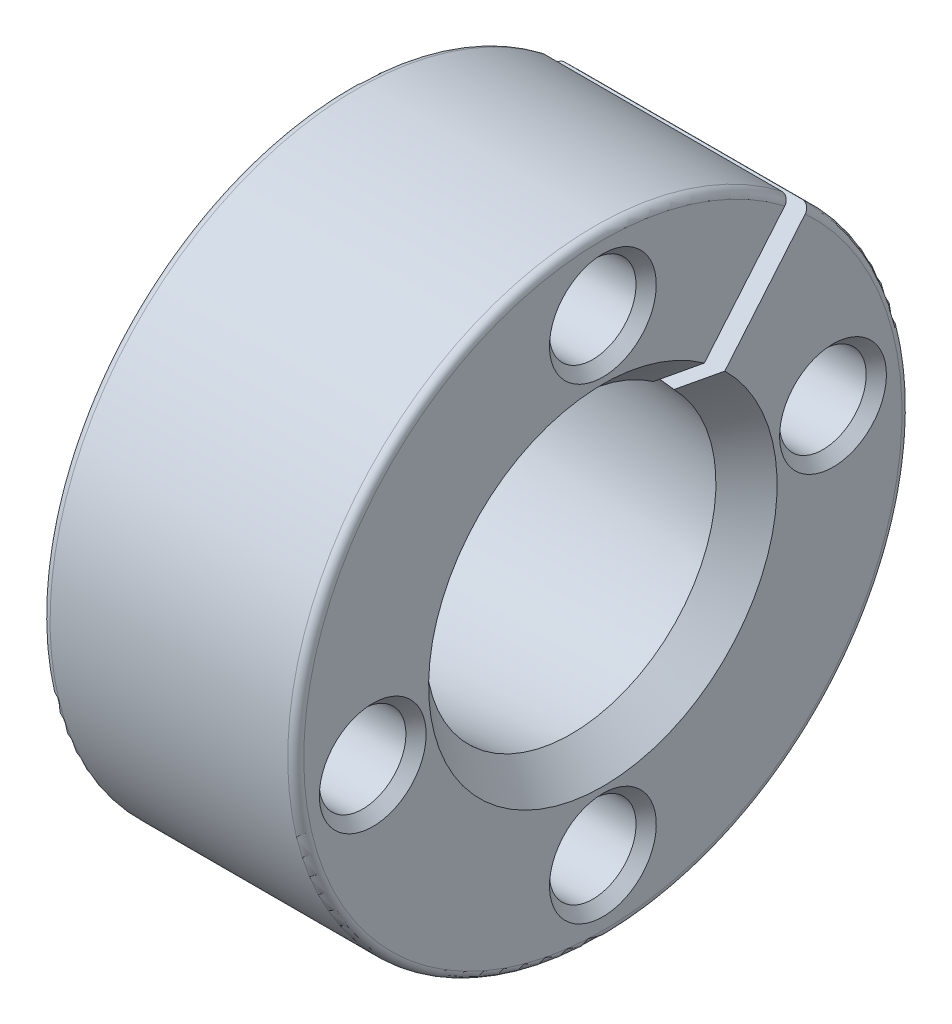
ISO-10303-21;
HEADER;
FILE_DESCRIPTION(('STEP AP214'),'2;1');
FILE_NAME('part.step','',(''),(''),'','','');
FILE_SCHEMA(('AUTOMOTIVE_DESIGN { 1 0 10303 214 1 1 1 1 }'));
ENDSEC;
DATA;
#1=APPLICATION_CONTEXT('core data for automotive mechanical design processes');
#2=APPLICATION_PROTOCOL_DEFINITION('international standard','automotive_design',2000,#1);
#3=PRODUCT_CONTEXT('',#1,'mechanical');
#4=PRODUCT('Part','Part','',(#3));
#5=PRODUCT_RELATED_PRODUCT_CATEGORY('part','',(#4));
#6=PRODUCT_DEFINITION_FORMATION('','',#4);
#7=PRODUCT_DEFINITION_CONTEXT('part definition',#1,'design');
#8=PRODUCT_DEFINITION('design','',#6,#7);
#9=PRODUCT_DEFINITION_SHAPE('','',#8);
#10=(LENGTH_UNIT() NAMED_UNIT(*) SI_UNIT(.MILLI.,.METRE.));
#11=(NAMED_UNIT(*) PLANE_ANGLE_UNIT() SI_UNIT($,.RADIAN.));
#12=(NAMED_UNIT(*) SI_UNIT($,.STERADIAN.) SOLID_ANGLE_UNIT());
#13=UNCERTAINTY_MEASURE_WITH_UNIT(LENGTH_MEASURE(1.E-05),#10,'distance_accuracy_value','');
#14=(GEOMETRIC_REPRESENTATION_CONTEXT(3) GLOBAL_UNCERTAINTY_ASSIGNED_CONTEXT((#13)) GLOBAL_UNIT_ASSIGNED_CONTEXT((#10,
#11,#12)) REPRESENTATION_CONTEXT('',''));
#15=CARTESIAN_POINT('',(0.,0.,0.));
#16=DIRECTION('',(0.,0.,1.));
#17=DIRECTION('',(1.,0.,0.));
#18=AXIS2_PLACEMENT_3D('',#15,#16,#17);
#19=CARTESIAN_POINT('',(9.45229304626,0.,0.));
#20=DIRECTION('',(-1.,0.,0.));
#21=DIRECTION('',(0.,-0.766044443118938,0.642787609686587));
#22=AXIS2_PLACEMENT_3D('',#19,#20,#21);
#23=CONICAL_SURFACE('',#22,5.792886407972,0.0872664632791204);
#24=CARTESIAN_POINT('',(13.60456636236,0.,0.));
#25=DIRECTION('',(1.,0.,0.));
#26=DIRECTION('',(0.,0.821982082959089,-0.569513349531192));
#27=AXIS2_PLACEMENT_3D('',#24,#25,#26);
#28=CIRCLE('',#27,5.429609562109);
#29=CARTESIAN_POINT('',(13.6045663614589,4.46304268143437,-3.09223382319891));
#30=VERTEX_POINT('',#29);
#31=CARTESIAN_POINT('',(13.6045664743908,3.82025536171201,-3.85827803734996));
#32=VERTEX_POINT('',#31);
#33=EDGE_CURVE('E209',#30,#32,#28,.T.);
#34=ORIENTED_EDGE('',*,*,#33,.T.);
#35=CARTESIAN_POINT('',(13.6045664728602,3.82025558096288,-3.85827774895613));
#36=CARTESIAN_POINT('',(12.6993830436782,3.88118002490425,-3.9093994423004));
#37=CARTESIAN_POINT('',(11.7883443821218,3.94248680688011,-3.96084262971302));
#38=CARTESIAN_POINT('',(10.8714186642083,4.00417967384711,-4.01260933215861));
#39=CARTESIAN_POINT('',(9.9544903351109,4.06587271650055,-4.06437618202331));
#40=CARTESIAN_POINT('',(9.03167491569363,4.12795182883529,-4.11646655921036));
#41=CARTESIAN_POINT('',(8.10309184726951,4.19040954107758,-4.16887474506609));
#42=CARTESIAN_POINT('',(7.17450877884568,4.25286725331986,-4.2212829309218));
#43=CARTESIAN_POINT('',(6.240158061457,4.31570357166498,-4.27400891992099));
#44=CARTESIAN_POINT('',(5.3,4.37892201582121,-4.32705549309621));
#45=(BOUNDED_CURVE() B_SPLINE_CURVE(3,(#35,#36,#37,#38,#39,#40,#41,#42,#43,#44),.UNSPECIFIED.,
.F.,.F.) B_SPLINE_CURVE_WITH_KNOTS((4,3,3,4),(9.49250336571618E-07,0.3333333333333,
0.6666666666667,1.),
.UNSPECIFIED.) CURVE() GEOMETRIC_REPRESENTATION_ITEM() RATIONAL_B_SPLINE_CURVE((1.,1.,1.,1.,1.,
1.,1.,1.,1.,1.)) REPRESENTATION_ITEM(''));
#46=CARTESIAN_POINT('',(5.3,4.378922015821,-4.327055493096));
#47=VERTEX_POINT('',#46);
#48=EDGE_CURVE('E213',#32,#47,#45,.T.);
#49=ORIENTED_EDGE('',*,*,#48,.T.);
#50=CARTESIAN_POINT('',(5.3,0.,0.));
#51=DIRECTION('',(1.,0.,0.));
#52=DIRECTION('',(0.,0.815720443136657,-0.578446331692869));
#53=AXIS2_PLACEMENT_3D('',#50,#51,#52);
#54=CIRCLE('',#53,6.15616498);
#55=CARTESIAN_POINT('',(5.3,5.021709625508,-3.561011049977));
#56=VERTEX_POINT('',#55);
#57=EDGE_CURVE('E193',#56,#47,#54,.T.);
#58=ORIENTED_EDGE('',*,*,#57,.F.);
#59=CARTESIAN_POINT('',(5.29999999989053,5.02170962551509,-3.56101104998258));
#60=CARTESIAN_POINT('',(9.71463931744375,4.72485887178575,-3.31192369201361));
#61=CARTESIAN_POINT('',(13.6045663614922,4.46304268170395,-3.09223382347976));
#62=(BOUNDED_CURVE() B_SPLINE_CURVE(2,(#59,#60,#61),.UNSPECIFIED.,.F.,
.F.) B_SPLINE_CURVE_WITH_KNOTS((3,3),(-1.06186326919593,-0.236612501797713),
.UNSPECIFIED.) CURVE() GEOMETRIC_REPRESENTATION_ITEM() RATIONAL_B_SPLINE_CURVE((1.00057406821849,
1.00291005328741,1.00126837696854)) REPRESENTATION_ITEM(''));
#63=EDGE_CURVE('E252',#56,#30,#62,.T.);
#64=ORIENTED_EDGE('',*,*,#63,.T.);
#65=EDGE_LOOP('',(#34,#49,#58,#64));
#66=FACE_BOUND('',#65,.T.);
#67=ADVANCED_FACE('F17',(#66),#23,.F.);
#68=CARTESIAN_POINT('',(5.6,0.,0.));
#69=DIRECTION('',(1.,0.,0.));
#70=DIRECTION('',(0.,-0.766044443118974,0.642787609686544));
#71=AXIS2_PLACEMENT_3D('',#68,#69,#70);
#72=TOROIDAL_SURFACE('',#71,11.2,0.2999999999999);
#73=CARTESIAN_POINT('',(5.3,0.,0.));
#74=DIRECTION('',(-1.,0.,0.));
#75=DIRECTION('',(0.,0.736584829542189,-0.67634516993049));
#76=AXIS2_PLACEMENT_3D('',#73,#74,#75);
#77=CIRCLE('',#76,11.2);
#78=CARTESIAN_POINT('',(5.3,8.249750090872,-7.575065903222));
#79=VERTEX_POINT('',#78);
#80=CARTESIAN_POINT('',(5.3,8.892537700559,-6.809021460103));
#81=VERTEX_POINT('',#80);
#82=EDGE_CURVE('E235',#79,#81,#77,.T.);
#83=ORIENTED_EDGE('',*,*,#82,.F.);
#84=CARTESIAN_POINT('',(5.6000155400862,8.24973942092816,-7.57505646767784));
#85=DIRECTION('',(1.23167270784557E-06,-0.642788552285189,-0.76604365218282));
#86=DIRECTION('',(-0.0250784289435294,0.765802701443531,-0.642586410425489));
#87=AXIS2_PLACEMENT_3D('',#84,#85,#86);
#88=ELLIPSE('',#87,0.300305995098755,0.300015357207849);
#89=CARTESIAN_POINT('',(5.6,8.479786782215,-7.768089606085));
#90=VERTEX_POINT('',#89);
#91=EDGE_CURVE('E218',#79,#90,#88,.T.);
#92=ORIENTED_EDGE('',*,*,#91,.T.);
#93=CARTESIAN_POINT('',(5.6,0.,0.));
#94=DIRECTION('',(1.,0.,0.));
#95=DIRECTION('',(0.,0.793267338426283,-0.608873492431787));
#96=AXIS2_PLACEMENT_3D('',#93,#94,#95);
#97=CIRCLE('',#96,11.5);
#98=CARTESIAN_POINT('',(5.6,9.122574391902,-7.002045162966));
#99=VERTEX_POINT('',#98);
#100=EDGE_CURVE('E11',#99,#90,#97,.T.);
#101=ORIENTED_EDGE('',*,*,#100,.F.);
#102=CARTESIAN_POINT('',(5.60001554502566,8.89252655263572,-6.80901258745491));
#103=DIRECTION('',(1.22955860408289E-06,0.642786668703303,0.766045232695693));
#104=DIRECTION('',(0.0250851533812018,-0.765804191897357,0.642584371699372));
#105=AXIS2_PLACEMENT_3D('',#102,#103,#104);
#106=ELLIPSE('',#105,0.300305999527031,0.300015362049478);
#107=EDGE_CURVE('E208',#99,#81,#106,.T.);
#108=ORIENTED_EDGE('',*,*,#107,.T.);
#109=EDGE_LOOP('',(#83,#92,#101,#108));
#110=FACE_BOUND('',#109,.T.);
#111=ADVANCED_FACE('F612',(#110),#72,.T.);
#112=CARTESIAN_POINT('',(0.,0.,0.));
#113=DIRECTION('',(1.,0.,0.));
#114=DIRECTION('',(0.,-0.766044443118974,0.642787609686544));
#115=AXIS2_PLACEMENT_3D('',#112,#113,#114);
#116=CYLINDRICAL_SURFACE('',#115,11.5);
#117=ORIENTED_EDGE('',*,*,#100,.T.);
#118=DIRECTION('',(1.,0.,0.));
#119=VECTOR('',#118,1.);
#120=CARTESIAN_POINT('',(5.6,8.479786782215,-7.768089606085));
#121=LINE('',#120,#119);
#122=CARTESIAN_POINT('',(14.5,8.479786782215,-7.768089606085));
#123=VERTEX_POINT('',#122);
#124=EDGE_CURVE('E303',#90,#123,#121,.T.);
#125=ORIENTED_EDGE('',*,*,#124,.T.);
#126=CARTESIAN_POINT('',(14.5,0.,0.));
#127=DIRECTION('',(1.,0.,0.));
#128=DIRECTION('',(0.,0.793267338426283,-0.608873492431787));
#129=AXIS2_PLACEMENT_3D('',#126,#127,#128);
#130=CIRCLE('',#129,11.5);
#131=CARTESIAN_POINT('',(14.5,9.122574391902,-7.002045162966));
#132=VERTEX_POINT('',#131);
#133=EDGE_CURVE('E28',#132,#123,#130,.T.);
#134=ORIENTED_EDGE('',*,*,#133,.F.);
#135=DIRECTION('',(1.,0.,0.));
#136=VECTOR('',#135,1.);
#137=CARTESIAN_POINT('',(5.6,9.122574391902,-7.002045162966));
#138=LINE('',#137,#136);
#139=EDGE_CURVE('E203',#99,#132,#138,.T.);
#140=ORIENTED_EDGE('',*,*,#139,.F.);
#141=EDGE_LOOP('',(#117,#125,#134,#140));
#142=FACE_BOUND('',#141,.T.);
#143=ADVANCED_FACE('F648',(#142),#116,.T.);
#144=CARTESIAN_POINT('',(14.5,0.,0.));
#145=DIRECTION('',(1.,0.,0.));
#146=DIRECTION('',(0.,-0.766044443118974,0.642787609686544));
#147=AXIS2_PLACEMENT_3D('',#144,#145,#146);
#148=TOROIDAL_SURFACE('',#147,11.2,0.2999999999999);
#149=ORIENTED_EDGE('',*,*,#133,.T.);
#150=CARTESIAN_POINT('',(14.4999844755531,8.24973942836584,-7.57505647747899));
#151=DIRECTION('',(-1.22258282185072E-06,-0.642788545328707,-0.766043658020031));
#152=DIRECTION('',(0.0250585690557596,0.765803088941565,-0.64258672339571));
#153=AXIS2_PLACEMENT_3D('',#150,#151,#152);
#154=ELLIPSE('',#153,0.300305982813762,0.300015341856135);
#155=CARTESIAN_POINT('',(14.8,8.249750090872,-7.575065903222));
#156=VERTEX_POINT('',#155);
#157=EDGE_CURVE('E180',#123,#156,#154,.T.);
#158=ORIENTED_EDGE('',*,*,#157,.T.);
#159=CARTESIAN_POINT('',(14.8,0.,0.));
#160=DIRECTION('',(1.,0.,0.));
#161=DIRECTION('',(0.,0.79397658040704,-0.60794834465203));
#162=AXIS2_PLACEMENT_3D('',#159,#160,#161);
#163=CIRCLE('',#162,11.2);
#164=CARTESIAN_POINT('',(14.8,8.892537700559,-6.809021460103));
#165=VERTEX_POINT('',#164);
#166=EDGE_CURVE('E335',#165,#156,#163,.T.);
#167=ORIENTED_EDGE('',*,*,#166,.F.);
#168=CARTESIAN_POINT('',(14.499984480425,8.89252656929436,-6.809012599662));
#169=DIRECTION('',(-1.22503658762442E-06,0.642786672164012,0.766045229791828));
#170=DIRECTION('',(-0.025051925352901,-0.765804827194845,0.642584910872631));
#171=AXIS2_PLACEMENT_3D('',#168,#169,#170);
#172=ELLIPSE('',#171,0.300305978437662,0.300015337080832);
#173=EDGE_CURVE('E207',#165,#132,#172,.T.);
#174=ORIENTED_EDGE('',*,*,#173,.T.);
#175=EDGE_LOOP('',(#149,#158,#167,#174));
#176=FACE_BOUND('',#175,.T.);
#177=ADVANCED_FACE('F401',(#176),#148,.T.);
#178=CARTESIAN_POINT('',(0.,0.3213938048433,0.3830222215595));
#179=DIRECTION('',(0.,0.642787609686505,0.766044443119007));
#180=DIRECTION('',(1.,0.,0.));
#181=AXIS2_PLACEMENT_3D('',#178,#179,#180);
#182=PLANE('',#181);
#183=CARTESIAN_POINT('',(14.7999999999957,5.30515442643131,-3.79884947789047));
#184=CARTESIAN_POINT('',(14.1471246311184,4.8455168464619,-3.41316775406296));
#185=CARTESIAN_POINT('',(13.604566361727,4.46304268119727,-3.0922338230546));
#186=(BOUNDED_CURVE() B_SPLINE_CURVE(2,(#183,#184,#185),.UNSPECIFIED.,.F.,
.F.) B_SPLINE_CURVE_WITH_KNOTS((3,3),(-2.11137095579985,-2.09513786870312),
.UNSPECIFIED.) CURVE() GEOMETRIC_REPRESENTATION_ITEM() RATIONAL_B_SPLINE_CURVE((1.1304381802653,
1.23566746739985,1.33927095215796)) REPRESENTATION_ITEM(''));
#187=CARTESIAN_POINT('',(14.8,5.305154426435,-3.798849477894));
#188=VERTEX_POINT('',#187);
#189=EDGE_CURVE('E212',#188,#30,#186,.T.);
#190=ORIENTED_EDGE('',*,*,#189,.T.);
#191=ORIENTED_EDGE('',*,*,#63,.F.);
#192=DIRECTION('',(0.,-0.766044443119006,0.642787609686506));
#193=VECTOR('',#192,1.);
#194=CARTESIAN_POINT('',(5.3,8.892537700559,-6.809021460103));
#195=LINE('',#194,#193);
#196=EDGE_CURVE('E231',#81,#56,#195,.T.);
#197=ORIENTED_EDGE('',*,*,#196,.F.);
#198=ORIENTED_EDGE('',*,*,#107,.F.);
#199=ORIENTED_EDGE('',*,*,#139,.T.);
#200=ORIENTED_EDGE('',*,*,#173,.F.);
#201=DIRECTION('',(0.,-0.766044443119007,0.642787609686505));
#202=VECTOR('',#201,1.);
#203=CARTESIAN_POINT('',(14.8,8.892537700559,-6.809021460103));
#204=LINE('',#203,#202);
#205=EDGE_CURVE('E21',#165,#188,#204,.T.);
#206=ORIENTED_EDGE('',*,*,#205,.T.);
#207=EDGE_LOOP('',(#190,#191,#197,#198,#199,#200,#206));
#208=FACE_BOUND('',#207,.T.);
#209=ADVANCED_FACE('F639',(#208),#182,.F.);
#210=CARTESIAN_POINT('',(14.20223195924,0.,0.));
#211=DIRECTION('',(1.,0.,0.));
#212=DIRECTION('',(0.,-0.76604444311897,0.64278760968655));
#213=AXIS2_PLACEMENT_3D('',#210,#211,#212);
#214=CONICAL_SURFACE('',#213,5.977269179793,0.74176493175795);
#215=CARTESIAN_POINT('',(13.6045664602119,3.8202551409373,-3.85827832442946));
#216=CARTESIAN_POINT('',(14.1471246898719,4.20272927813906,-4.17921223189027));
#217=CARTESIAN_POINT('',(14.7999999999951,4.66236681674434,-4.56489392100917));
#218=(BOUNDED_CURVE() B_SPLINE_CURVE(2,(#215,#216,#217),.UNSPECIFIED.,.F.,
.F.) B_SPLINE_CURVE_WITH_KNOTS((3,3),(-0.0262463265678555,-0.0100132410679797),
.UNSPECIFIED.) CURVE() GEOMETRIC_REPRESENTATION_ITEM() RATIONAL_B_SPLINE_CURVE((1.33927093177512,
1.23566745704854,1.13043818026539)) REPRESENTATION_ITEM(''));
#219=CARTESIAN_POINT('',(14.8,4.662366816748,-4.564893921013));
#220=VERTEX_POINT('',#219);
#221=EDGE_CURVE('E350',#32,#220,#218,.T.);
#222=ORIENTED_EDGE('',*,*,#221,.F.);
#223=ORIENTED_EDGE('',*,*,#33,.F.);
#224=ORIENTED_EDGE('',*,*,#189,.F.);
#225=CARTESIAN_POINT('',(14.8,0.,0.));
#226=DIRECTION('',(1.,0.,0.));
#227=DIRECTION('',(0.,0.813047662014442,-0.58219713095553));
#228=AXIS2_PLACEMENT_3D('',#225,#226,#227);
#229=CIRCLE('',#228,6.52502267);
#230=EDGE_CURVE('E318',#188,#220,#229,.T.);
#231=ORIENTED_EDGE('',*,*,#230,.T.);
#232=EDGE_LOOP('',(#222,#223,#224,#231));
#233=FACE_BOUND('',#232,.T.);
#234=ADVANCED_FACE('F391',(#233),#214,.F.);
#235=CARTESIAN_POINT('',(0.,-0.3213938048433,-0.3830222215595));
#236=DIRECTION('',(0.,0.642787609686505,0.766044443119007));
#237=DIRECTION('',(1.,0.,0.));
#238=AXIS2_PLACEMENT_3D('',#235,#236,#237);
#239=PLANE('',#238);
#240=ORIENTED_EDGE('',*,*,#221,.T.);
#241=DIRECTION('',(0.,-0.766044443119007,0.642787609686505));
#242=VECTOR('',#241,1.);
#243=CARTESIAN_POINT('',(14.8,8.249750090872,-7.575065903222));
#244=LINE('',#243,#242);
#245=EDGE_CURVE('E290',#156,#220,#244,.T.);
#246=ORIENTED_EDGE('',*,*,#245,.F.);
#247=ORIENTED_EDGE('',*,*,#157,.F.);
#248=ORIENTED_EDGE('',*,*,#124,.F.);
#249=ORIENTED_EDGE('',*,*,#91,.F.);
#250=DIRECTION('',(0.,-0.766044443119006,0.642787609686506));
#251=VECTOR('',#250,1.);
#252=CARTESIAN_POINT('',(5.3,8.249750090872,-7.575065903222));
#253=LINE('',#252,#251);
#254=EDGE_CURVE('E281',#79,#47,#253,.T.);
#255=ORIENTED_EDGE('',*,*,#254,.T.);
#256=ORIENTED_EDGE('',*,*,#48,.F.);
#257=EDGE_LOOP('',(#240,#246,#247,#248,#249,#255,#256));
#258=FACE_BOUND('',#257,.T.);
#259=ADVANCED_FACE('F383',(#258),#239,.T.);
#260=CARTESIAN_POINT('',(14.6105,1.519421554586,-8.617067838857));
#261=DIRECTION('',(1.,0.,0.));
#262=DIRECTION('',(0.,-1.,0.));
#263=AXIS2_PLACEMENT_3D('',#260,#261,#262);
#264=CONICAL_SURFACE('',#263,1.8105,0.785398163397448);
#265=CARTESIAN_POINT('',(14.421,1.519421554586,-8.617067838857));
#266=DIRECTION('',(1.,0.,0.));
#267=DIRECTION('',(0.,-1.,0.));
#268=AXIS2_PLACEMENT_3D('',#265,#266,#267);
#269=CIRCLE('',#268,1.621);
#270=CARTESIAN_POINT('',(14.421,3.140421554586,-8.617067838857));
#271=VERTEX_POINT('',#270);
#272=EDGE_CURVE('E298',#271,#271,#269,.T.);
#273=ORIENTED_EDGE('',*,*,#272,.F.);
#274=DIRECTION('',(0.707106781186548,0.707106781186548,0.));
#275=VECTOR('',#274,1.);
#276=CARTESIAN_POINT('',(14.6105,3.329921554586,-8.617067838857));
#277=LINE('',#276,#275);
#278=CARTESIAN_POINT('',(14.8,3.519421554586,-8.617067838857));
#279=VERTEX_POINT('',#278);
#280=EDGE_CURVE('E302',#271,#279,#277,.T.);
#281=ORIENTED_EDGE('',*,*,#280,.T.);
#282=CARTESIAN_POINT('',(14.8,1.519421554586,-8.617067838857));
#283=DIRECTION('',(1.,0.,0.));
#284=DIRECTION('',(0.,-1.,0.));
#285=AXIS2_PLACEMENT_3D('',#282,#283,#284);
#286=CIRCLE('',#285,2.);
#287=EDGE_CURVE('E186',#279,#279,#286,.T.);
#288=ORIENTED_EDGE('',*,*,#287,.T.);
#289=ORIENTED_EDGE('',*,*,#280,.F.);
#290=EDGE_LOOP('',(#273,#281,#288,#289));
#291=FACE_BOUND('',#290,.T.);
#292=ADVANCED_FACE('F602',(#291),#264,.F.);
#293=CARTESIAN_POINT('',(4.825,1.519421554586,-8.617067838857));
#294=DIRECTION('',(1.,0.,0.));
#295=DIRECTION('',(0.,-1.,0.));
#296=AXIS2_PLACEMENT_3D('',#293,#294,#295);
#297=CYLINDRICAL_SURFACE('',#296,1.621);
#298=CARTESIAN_POINT('',(5.679,1.519421554586,-8.617067838857));
#299=DIRECTION('',(1.,0.,0.));
#300=DIRECTION('',(0.,-1.,0.));
#301=AXIS2_PLACEMENT_3D('',#298,#299,#300);
#302=CIRCLE('',#301,1.621);
#303=CARTESIAN_POINT('',(5.679,3.140421554586,-8.617067838857));
#304=VERTEX_POINT('',#303);
#305=CARTESIAN_POINT('',(5.679,-0.101578445413999,-8.617067838857));
#306=VERTEX_POINT('',#305);
#307=EDGE_CURVE('E224',#304,#306,#302,.T.);
#308=ORIENTED_EDGE('',*,*,#307,.F.);
#309=DIRECTION('',(1.,0.,0.));
#310=VECTOR('',#309,1.);
#311=CARTESIAN_POINT('',(4.825,3.140421554586,-8.617067838857));
#312=LINE('',#311,#310);
#313=EDGE_CURVE('E201',#304,#271,#312,.T.);
#314=ORIENTED_EDGE('',*,*,#313,.T.);
#315=ORIENTED_EDGE('',*,*,#272,.T.);
#316=ORIENTED_EDGE('',*,*,#313,.F.);
#317=CARTESIAN_POINT('',(5.679,1.519421554586,-8.617067838857));
#318=DIRECTION('',(1.,0.,0.));
#319=DIRECTION('',(0.,-1.,0.));
#320=AXIS2_PLACEMENT_3D('',#317,#318,#319);
#321=CIRCLE('',#320,1.621);
#322=EDGE_CURVE('E197',#306,#304,#321,.T.);
#323=ORIENTED_EDGE('',*,*,#322,.F.);
#324=EDGE_LOOP('',(#308,#314,#315,#316,#323));
#325=FACE_BOUND('',#324,.T.);
#326=ADVANCED_FACE('F584',(#325),#297,.F.);
#327=CARTESIAN_POINT('',(5.4895,1.519421554586,-8.617067838857));
#328=DIRECTION('',(-1.,0.,0.));
#329=DIRECTION('',(0.,1.,0.));
#330=AXIS2_PLACEMENT_3D('',#327,#328,#329);
#331=CONICAL_SURFACE('',#330,1.8105,0.785398163397448);
#332=ORIENTED_EDGE('',*,*,#307,.T.);
#333=DIRECTION('',(-0.707106781186548,-0.707106781186548,0.));
#334=VECTOR('',#333,1.);
#335=CARTESIAN_POINT('',(5.4895,-0.291078445414,-8.617067838857));
#336=LINE('',#335,#334);
#337=CARTESIAN_POINT('',(5.3,-0.480578445414,-8.617067838857));
#338=VERTEX_POINT('',#337);
#339=EDGE_CURVE('E202',#306,#338,#336,.T.);
#340=ORIENTED_EDGE('',*,*,#339,.T.);
#341=CARTESIAN_POINT('',(5.3,1.519421554586,-8.617067838857));
#342=DIRECTION('',(1.,0.,0.));
#343=DIRECTION('',(0.,-1.,0.));
#344=AXIS2_PLACEMENT_3D('',#341,#342,#343);
#345=CIRCLE('',#344,2.);
#346=EDGE_CURVE('E282',#338,#338,#345,.T.);
#347=ORIENTED_EDGE('',*,*,#346,.F.);
#348=ORIENTED_EDGE('',*,*,#339,.F.);
#349=ORIENTED_EDGE('',*,*,#322,.T.);
#350=EDGE_LOOP('',(#332,#340,#347,#348,#349));
#351=FACE_BOUND('',#350,.T.);
#352=ADVANCED_FACE('F578',(#351),#331,.F.);
#353=CARTESIAN_POINT('',(14.6105,-8.75,0.));
#354=DIRECTION('',(1.,0.,0.));
#355=DIRECTION('',(0.,-1.,0.));
#356=AXIS2_PLACEMENT_3D('',#353,#354,#355);
#357=CONICAL_SURFACE('',#356,1.8105,0.785398163397448);
#358=CARTESIAN_POINT('',(14.421,-8.75,0.));
#359=DIRECTION('',(1.,0.,0.));
#360=DIRECTION('',(0.,-1.,0.));
#361=AXIS2_PLACEMENT_3D('',#358,#359,#360);
#362=CIRCLE('',#361,1.621);
#363=CARTESIAN_POINT('',(14.421,-7.129,0.));
#364=VERTEX_POINT('',#363);
#365=EDGE_CURVE('E225',#364,#364,#362,.T.);
#366=ORIENTED_EDGE('',*,*,#365,.F.);
#367=DIRECTION('',(0.707106781186548,0.707106781186548,0.));
#368=VECTOR('',#367,1.);
#369=CARTESIAN_POINT('',(14.6105,-6.9395,0.));
#370=LINE('',#369,#368);
#371=CARTESIAN_POINT('',(14.8,-6.75,0.));
#372=VERTEX_POINT('',#371);
#373=EDGE_CURVE('E228',#364,#372,#370,.T.);
#374=ORIENTED_EDGE('',*,*,#373,.T.);
#375=CARTESIAN_POINT('',(14.8,-8.75,0.));
#376=DIRECTION('',(1.,0.,0.));
#377=DIRECTION('',(0.,-1.,0.));
#378=AXIS2_PLACEMENT_3D('',#375,#376,#377);
#379=CIRCLE('',#378,2.);
#380=EDGE_CURVE('E182',#372,#372,#379,.T.);
#381=ORIENTED_EDGE('',*,*,#380,.T.);
#382=ORIENTED_EDGE('',*,*,#373,.F.);
#383=EDGE_LOOP('',(#366,#374,#381,#382));
#384=FACE_BOUND('',#383,.T.);
#385=ADVANCED_FACE('F583',(#384),#357,.F.);
#386=CARTESIAN_POINT('',(4.825,-8.75,0.));
#387=DIRECTION('',(1.,0.,0.));
#388=DIRECTION('',(0.,-1.,0.));
#389=AXIS2_PLACEMENT_3D('',#386,#387,#388);
#390=CYLINDRICAL_SURFACE('',#389,1.621);
#391=CARTESIAN_POINT('',(5.679,-8.75,0.));
#392=DIRECTION('',(1.,0.,0.));
#393=DIRECTION('',(0.,-1.,0.));
#394=AXIS2_PLACEMENT_3D('',#391,#392,#393);
#395=CIRCLE('',#394,1.621);
#396=CARTESIAN_POINT('',(5.679,-7.129,0.));
#397=VERTEX_POINT('',#396);
#398=CARTESIAN_POINT('',(5.679,-10.371,0.));
#399=VERTEX_POINT('',#398);
#400=EDGE_CURVE('E246',#397,#399,#395,.T.);
#401=ORIENTED_EDGE('',*,*,#400,.F.);
#402=DIRECTION('',(1.,0.,0.));
#403=VECTOR('',#402,1.);
#404=CARTESIAN_POINT('',(4.825,-7.129,0.));
#405=LINE('',#404,#403);
#406=EDGE_CURVE('E229',#397,#364,#405,.T.);
#407=ORIENTED_EDGE('',*,*,#406,.T.);
#408=ORIENTED_EDGE('',*,*,#365,.T.);
#409=ORIENTED_EDGE('',*,*,#406,.F.);
#410=CARTESIAN_POINT('',(5.679,-8.75,0.));
#411=DIRECTION('',(1.,0.,0.));
#412=DIRECTION('',(0.,-1.,0.));
#413=AXIS2_PLACEMENT_3D('',#410,#411,#412);
#414=CIRCLE('',#413,1.621);
#415=EDGE_CURVE('E243',#399,#397,#414,.T.);
#416=ORIENTED_EDGE('',*,*,#415,.F.);
#417=EDGE_LOOP('',(#401,#407,#408,#409,#416));
#418=FACE_BOUND('',#417,.T.);
#419=ADVANCED_FACE('F620',(#418),#390,.F.);
#420=CARTESIAN_POINT('',(5.4895,-8.75,0.));
#421=DIRECTION('',(-1.,0.,0.));
#422=DIRECTION('',(0.,1.,0.));
#423=AXIS2_PLACEMENT_3D('',#420,#421,#422);
#424=CONICAL_SURFACE('',#423,1.8105,0.785398163397448);
#425=ORIENTED_EDGE('',*,*,#400,.T.);
#426=DIRECTION('',(-0.707106781186548,-0.707106781186548,0.));
#427=VECTOR('',#426,1.);
#428=CARTESIAN_POINT('',(5.4895,-10.5605,0.));
#429=LINE('',#428,#427);
#430=CARTESIAN_POINT('',(5.3,-10.75,0.));
#431=VERTEX_POINT('',#430);
#432=EDGE_CURVE('E294',#399,#431,#429,.T.);
#433=ORIENTED_EDGE('',*,*,#432,.T.);
#434=CARTESIAN_POINT('',(5.3,-8.75,0.));
#435=DIRECTION('',(1.,0.,0.));
#436=DIRECTION('',(0.,-1.,0.));
#437=AXIS2_PLACEMENT_3D('',#434,#435,#436);
#438=CIRCLE('',#437,2.);
#439=EDGE_CURVE('E192',#431,#431,#438,.T.);
#440=ORIENTED_EDGE('',*,*,#439,.F.);
#441=ORIENTED_EDGE('',*,*,#432,.F.);
#442=ORIENTED_EDGE('',*,*,#415,.T.);
#443=EDGE_LOOP('',(#425,#433,#440,#441,#442));
#444=FACE_BOUND('',#443,.T.);
#445=ADVANCED_FACE('F562',(#444),#424,.F.);
#446=CARTESIAN_POINT('',(14.6105,-1.519421554586,8.617067838857));
#447=DIRECTION('',(1.,0.,0.));
#448=DIRECTION('',(0.,-1.,0.));
#449=AXIS2_PLACEMENT_3D('',#446,#447,#448);
#450=CONICAL_SURFACE('',#449,1.8105,0.785398163397448);
#451=CARTESIAN_POINT('',(14.421,-1.519421554586,8.617067838857));
#452=DIRECTION('',(1.,0.,0.));
#453=DIRECTION('',(0.,-1.,0.));
#454=AXIS2_PLACEMENT_3D('',#451,#452,#453);
#455=CIRCLE('',#454,1.621);
#456=CARTESIAN_POINT('',(14.421,0.1015784454144,8.617067838857));
#457=VERTEX_POINT('',#456);
#458=EDGE_CURVE('E247',#457,#457,#455,.T.);
#459=ORIENTED_EDGE('',*,*,#458,.F.);
#460=DIRECTION('',(0.707106781186548,0.707106781186548,0.));
#461=VECTOR('',#460,1.);
#462=CARTESIAN_POINT('',(14.6105,0.291078445414,8.617067838857));
#463=LINE('',#462,#461);
#464=CARTESIAN_POINT('',(14.8,0.4805784454144,8.617067838857));
#465=VERTEX_POINT('',#464);
#466=EDGE_CURVE('E244',#457,#465,#463,.T.);
#467=ORIENTED_EDGE('',*,*,#466,.T.);
#468=CARTESIAN_POINT('',(14.8,-1.519421554586,8.617067838857));
#469=DIRECTION('',(1.,0.,0.));
#470=DIRECTION('',(0.,-1.,0.));
#471=AXIS2_PLACEMENT_3D('',#468,#469,#470);
#472=CIRCLE('',#471,2.);
#473=EDGE_CURVE('E187',#465,#465,#472,.T.);
#474=ORIENTED_EDGE('',*,*,#473,.T.);
#475=ORIENTED_EDGE('',*,*,#466,.F.);
#476=EDGE_LOOP('',(#459,#467,#474,#475));
#477=FACE_BOUND('',#476,.T.);
#478=ADVANCED_FACE('F556',(#477),#450,.F.);
#479=CARTESIAN_POINT('',(4.825,-1.519421554586,8.617067838857));
#480=DIRECTION('',(1.,0.,0.));
#481=DIRECTION('',(0.,-1.,0.));
#482=AXIS2_PLACEMENT_3D('',#479,#480,#481);
#483=CYLINDRICAL_SURFACE('',#482,1.621);
#484=CARTESIAN_POINT('',(5.679,-1.519421554586,8.617067838857));
#485=DIRECTION('',(1.,0.,0.));
#486=DIRECTION('',(0.,-1.,0.));
#487=AXIS2_PLACEMENT_3D('',#484,#485,#486);
#488=CIRCLE('',#487,1.621);
#489=CARTESIAN_POINT('',(5.679,0.1015784454144,8.617067838857));
#490=VERTEX_POINT('',#489);
#491=CARTESIAN_POINT('',(5.679,-3.140421554586,8.617067838857));
#492=VERTEX_POINT('',#491);
#493=EDGE_CURVE('E286',#490,#492,#488,.T.);
#494=ORIENTED_EDGE('',*,*,#493,.F.);
#495=DIRECTION('',(1.,0.,0.));
#496=VECTOR('',#495,1.);
#497=CARTESIAN_POINT('',(4.825,0.101578445414,8.617067838857));
#498=LINE('',#497,#496);
#499=EDGE_CURVE('E310',#490,#457,#498,.T.);
#500=ORIENTED_EDGE('',*,*,#499,.T.);
#501=ORIENTED_EDGE('',*,*,#458,.T.);
#502=ORIENTED_EDGE('',*,*,#499,.F.);
#503=CARTESIAN_POINT('',(5.679,-1.519421554586,8.617067838857));
#504=DIRECTION('',(1.,0.,0.));
#505=DIRECTION('',(0.,-1.,0.));
#506=AXIS2_PLACEMENT_3D('',#503,#504,#505);
#507=CIRCLE('',#506,1.621);
#508=EDGE_CURVE('E306',#492,#490,#507,.T.);
#509=ORIENTED_EDGE('',*,*,#508,.F.);
#510=EDGE_LOOP('',(#494,#500,#501,#502,#509));
#511=FACE_BOUND('',#510,.T.);
#512=ADVANCED_FACE('F561',(#511),#483,.F.);
#513=CARTESIAN_POINT('',(5.4895,-1.519421554586,8.617067838857));
#514=DIRECTION('',(-1.,0.,0.));
#515=DIRECTION('',(0.,1.,0.));
#516=AXIS2_PLACEMENT_3D('',#513,#514,#515);
#517=CONICAL_SURFACE('',#516,1.8105,0.785398163397448);
#518=ORIENTED_EDGE('',*,*,#493,.T.);
#519=DIRECTION('',(-0.707106781186548,-0.707106781186548,0.));
#520=VECTOR('',#519,1.);
#521=CARTESIAN_POINT('',(5.4895,-3.329921554586,8.617067838857));
#522=LINE('',#521,#520);
#523=CARTESIAN_POINT('',(5.3,-3.519421554586,8.617067838857));
#524=VERTEX_POINT('',#523);
#525=EDGE_CURVE('E311',#492,#524,#522,.T.);
#526=ORIENTED_EDGE('',*,*,#525,.T.);
#527=CARTESIAN_POINT('',(5.3,-1.519421554586,8.617067838857));
#528=DIRECTION('',(1.,0.,0.));
#529=DIRECTION('',(0.,-1.,0.));
#530=AXIS2_PLACEMENT_3D('',#527,#528,#529);
#531=CIRCLE('',#530,2.);
#532=EDGE_CURVE('E188',#524,#524,#531,.T.);
#533=ORIENTED_EDGE('',*,*,#532,.F.);
#534=ORIENTED_EDGE('',*,*,#525,.F.);
#535=ORIENTED_EDGE('',*,*,#508,.T.);
#536=EDGE_LOOP('',(#518,#526,#533,#534,#535));
#537=FACE_BOUND('',#536,.T.);
#538=ADVANCED_FACE('F549',(#537),#517,.F.);
#539=CARTESIAN_POINT('',(5.3,0.,0.));
#540=DIRECTION('',(1.,0.,0.));
#541=DIRECTION('',(0.,1.,0.));
#542=AXIS2_PLACEMENT_3D('',#539,#540,#541);
#543=PLANE('',#542);
#544=CARTESIAN_POINT('',(5.3,8.75,0.));
#545=DIRECTION('',(1.,0.,0.));
#546=DIRECTION('',(0.,-1.,0.));
#547=AXIS2_PLACEMENT_3D('',#544,#545,#546);
#548=CIRCLE('',#547,2.);
#549=CARTESIAN_POINT('',(5.3,6.75,0.));
#550=VERTEX_POINT('',#549);
#551=EDGE_CURVE('E351',#550,#550,#548,.T.);
#552=ORIENTED_EDGE('',*,*,#551,.T.);
#553=EDGE_LOOP('',(#552));
#554=FACE_BOUND('',#553,.T.);
#555=ORIENTED_EDGE('',*,*,#346,.T.);
#556=EDGE_LOOP('',(#555));
#557=FACE_BOUND('',#556,.T.);
#558=ORIENTED_EDGE('',*,*,#439,.T.);
#559=EDGE_LOOP('',(#558));
#560=FACE_BOUND('',#559,.T.);
#561=ORIENTED_EDGE('',*,*,#532,.T.);
#562=EDGE_LOOP('',(#561));
#563=FACE_BOUND('',#562,.T.);
#564=ORIENTED_EDGE('',*,*,#254,.F.);
#565=ORIENTED_EDGE('',*,*,#82,.T.);
#566=ORIENTED_EDGE('',*,*,#196,.T.);
#567=ORIENTED_EDGE('',*,*,#57,.T.);
#568=EDGE_LOOP('',(#564,#565,#566,#567));
#569=FACE_BOUND('',#568,.T.);
#570=ADVANCED_FACE('F388',(#554,#557,#560,#563,#569),#543,.F.);
#571=CARTESIAN_POINT('',(5.4895,8.75,0.));
#572=DIRECTION('',(-1.,0.,0.));
#573=DIRECTION('',(0.,1.,0.));
#574=AXIS2_PLACEMENT_3D('',#571,#572,#573);
#575=CONICAL_SURFACE('',#574,1.8105,0.785398163397448);
#576=CARTESIAN_POINT('',(5.679,8.75,0.));
#577=DIRECTION('',(-1.,0.,0.));
#578=DIRECTION('',(0.,-1.,0.));
#579=AXIS2_PLACEMENT_3D('',#576,#577,#578);
#580=CIRCLE('',#579,1.621);
#581=CARTESIAN_POINT('',(5.679,10.371,0.));
#582=VERTEX_POINT('',#581);
#583=CARTESIAN_POINT('',(5.679,7.129,0.));
#584=VERTEX_POINT('',#583);
#585=EDGE_CURVE('E167',#582,#584,#580,.T.);
#586=ORIENTED_EDGE('',*,*,#585,.F.);
#587=CARTESIAN_POINT('',(5.679,8.75,0.));
#588=DIRECTION('',(-1.,0.,0.));
#589=DIRECTION('',(0.,-1.,0.));
#590=AXIS2_PLACEMENT_3D('',#587,#588,#589);
#591=CIRCLE('',#590,1.621);
#592=EDGE_CURVE('E175',#584,#582,#591,.T.);
#593=ORIENTED_EDGE('',*,*,#592,.F.);
#594=DIRECTION('',(-0.707106781186548,-0.707106781186548,0.));
#595=VECTOR('',#594,1.);
#596=CARTESIAN_POINT('',(5.4895,6.9395,0.));
#597=LINE('',#596,#595);
#598=EDGE_CURVE('E326',#584,#550,#597,.T.);
#599=ORIENTED_EDGE('',*,*,#598,.T.);
#600=ORIENTED_EDGE('',*,*,#551,.F.);
#601=ORIENTED_EDGE('',*,*,#598,.F.);
#602=EDGE_LOOP('',(#586,#593,#599,#600,#601));
#603=FACE_BOUND('',#602,.T.);
#604=ADVANCED_FACE('F19',(#603),#575,.F.);
#605=CARTESIAN_POINT('',(4.825,8.75,0.));
#606=DIRECTION('',(1.,0.,0.));
#607=DIRECTION('',(0.,-1.,0.));
#608=AXIS2_PLACEMENT_3D('',#605,#606,#607);
#609=CYLINDRICAL_SURFACE('',#608,1.621);
#610=ORIENTED_EDGE('',*,*,#585,.T.);
#611=ORIENTED_EDGE('',*,*,#592,.T.);
#612=DIRECTION('',(1.,0.,0.));
#613=VECTOR('',#612,1.);
#614=CARTESIAN_POINT('',(4.825,10.371,0.));
#615=LINE('',#614,#613);
#616=CARTESIAN_POINT('',(14.421,10.371,0.));
#617=VERTEX_POINT('',#616);
#618=EDGE_CURVE('E239',#582,#617,#615,.T.);
#619=ORIENTED_EDGE('',*,*,#618,.T.);
#620=CARTESIAN_POINT('',(14.421,8.75,0.));
#621=DIRECTION('',(1.,0.,0.));
#622=DIRECTION('',(0.,-1.,0.));
#623=AXIS2_PLACEMENT_3D('',#620,#621,#622);
#624=CIRCLE('',#623,1.621);
#625=EDGE_CURVE('E165',#617,#617,#624,.T.);
#626=ORIENTED_EDGE('',*,*,#625,.T.);
#627=ORIENTED_EDGE('',*,*,#618,.F.);
#628=EDGE_LOOP('',(#610,#611,#619,#626,#627));
#629=FACE_BOUND('',#628,.T.);
#630=ADVANCED_FACE('F569',(#629),#609,.F.);
#631=CARTESIAN_POINT('',(14.6105,8.75,0.));
#632=DIRECTION('',(1.,0.,0.));
#633=DIRECTION('',(0.,-1.,0.));
#634=AXIS2_PLACEMENT_3D('',#631,#632,#633);
#635=CONICAL_SURFACE('',#634,1.8105,0.785398163397448);
#636=ORIENTED_EDGE('',*,*,#625,.F.);
#637=DIRECTION('',(0.707106781186548,0.707106781186548,0.));
#638=VECTOR('',#637,1.);
#639=CARTESIAN_POINT('',(14.6105,10.5605,0.));
#640=LINE('',#639,#638);
#641=CARTESIAN_POINT('',(14.8,10.75,0.));
#642=VERTEX_POINT('',#641);
#643=EDGE_CURVE('E160',#617,#642,#640,.T.);
#644=ORIENTED_EDGE('',*,*,#643,.T.);
#645=CARTESIAN_POINT('',(14.8,8.75,0.));
#646=DIRECTION('',(1.,0.,0.));
#647=DIRECTION('',(0.,-1.,0.));
#648=AXIS2_PLACEMENT_3D('',#645,#646,#647);
#649=CIRCLE('',#648,2.);
#650=EDGE_CURVE('E163',#642,#642,#649,.T.);
#651=ORIENTED_EDGE('',*,*,#650,.T.);
#652=ORIENTED_EDGE('',*,*,#643,.F.);
#653=EDGE_LOOP('',(#636,#644,#651,#652));
#654=FACE_BOUND('',#653,.T.);
#655=ADVANCED_FACE('F161',(#654),#635,.F.);
#656=CARTESIAN_POINT('',(14.8,0.,0.));
#657=DIRECTION('',(1.,0.,0.));
#658=DIRECTION('',(0.,1.,0.));
#659=AXIS2_PLACEMENT_3D('',#656,#657,#658);
#660=PLANE('',#659);
#661=ORIENTED_EDGE('',*,*,#650,.F.);
#662=EDGE_LOOP('',(#661));
#663=FACE_BOUND('',#662,.T.);
#664=ORIENTED_EDGE('',*,*,#287,.F.);
#665=EDGE_LOOP('',(#664));
#666=FACE_BOUND('',#665,.T.);
#667=ORIENTED_EDGE('',*,*,#380,.F.);
#668=EDGE_LOOP('',(#667));
#669=FACE_BOUND('',#668,.T.);
#670=ORIENTED_EDGE('',*,*,#473,.F.);
#671=EDGE_LOOP('',(#670));
#672=FACE_BOUND('',#671,.T.);
#673=ORIENTED_EDGE('',*,*,#230,.F.);
#674=ORIENTED_EDGE('',*,*,#205,.F.);
#675=ORIENTED_EDGE('',*,*,#166,.T.);
#676=ORIENTED_EDGE('',*,*,#245,.T.);
#677=EDGE_LOOP('',(#673,#674,#675,#676));
#678=FACE_BOUND('',#677,.T.);
#679=ADVANCED_FACE('F397',(#663,#666,#669,#672,#678),#660,.T.);
#680=CLOSED_SHELL('',(#67,#111,#143,#177,#209,#234,#259,#292,#326,#352,#385,#419,#445,#478,#512,
#538,#570,#604,#630,#655,#679));
#681=MANIFOLD_SOLID_BREP('B1',#680);
#682=ADVANCED_BREP_SHAPE_REPRESENTATION('',(#18,#681),#14);
#683=SHAPE_DEFINITION_REPRESENTATION(#9,#682);
ENDSEC;
END-ISO-10303-21;
